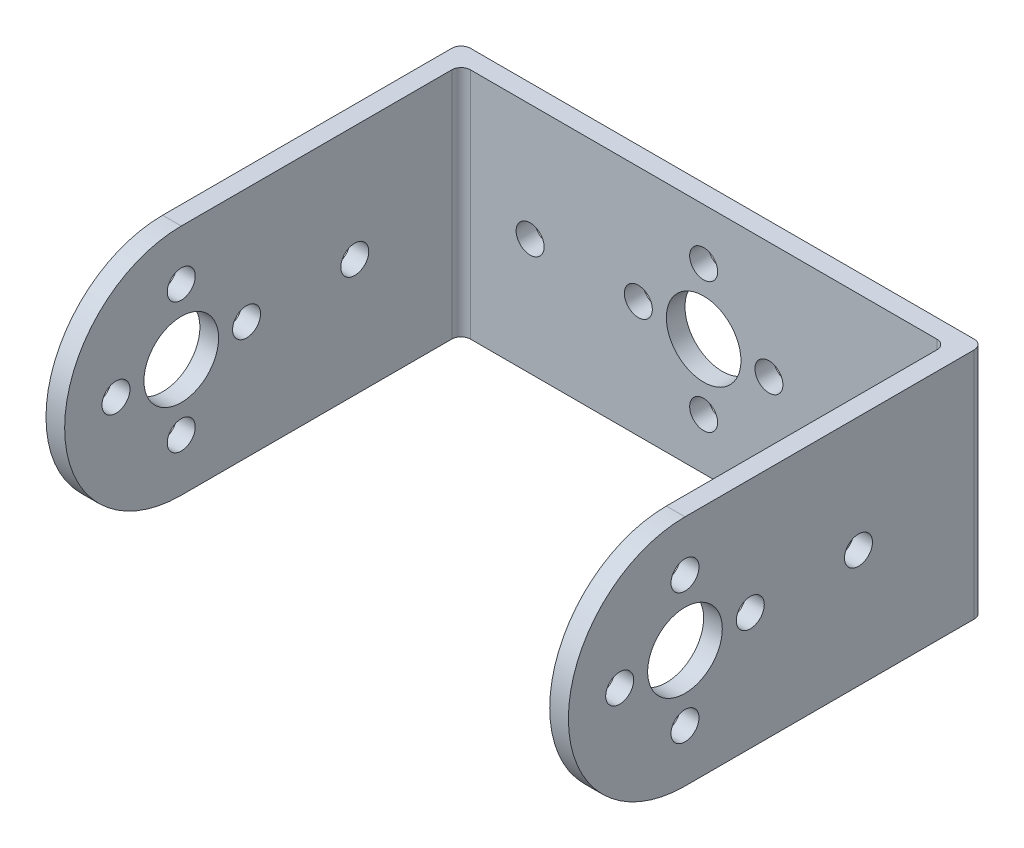
ISO-10303-21;
HEADER;
FILE_DESCRIPTION(('STEP AP214'),'2;1');
FILE_NAME('part.step','',(''),(''),'','','');
FILE_SCHEMA(('AUTOMOTIVE_DESIGN { 1 0 10303 214 1 1 1 1 }'));
ENDSEC;
DATA;
#1=APPLICATION_CONTEXT('core data for automotive mechanical design processes');
#2=APPLICATION_PROTOCOL_DEFINITION('international standard','automotive_design',2000,#1);
#3=PRODUCT_CONTEXT('',#1,'mechanical');
#4=PRODUCT('Part','Part','',(#3));
#5=PRODUCT_RELATED_PRODUCT_CATEGORY('part','',(#4));
#6=PRODUCT_DEFINITION_FORMATION('','',#4);
#7=PRODUCT_DEFINITION_CONTEXT('part definition',#1,'design');
#8=PRODUCT_DEFINITION('design','',#6,#7);
#9=PRODUCT_DEFINITION_SHAPE('','',#8);
#10=(LENGTH_UNIT() NAMED_UNIT(*) SI_UNIT(.MILLI.,.METRE.));
#11=(NAMED_UNIT(*) PLANE_ANGLE_UNIT() SI_UNIT($,.RADIAN.));
#12=(NAMED_UNIT(*) SI_UNIT($,.STERADIAN.) SOLID_ANGLE_UNIT());
#13=UNCERTAINTY_MEASURE_WITH_UNIT(LENGTH_MEASURE(1.E-05),#10,'distance_accuracy_value','');
#14=(GEOMETRIC_REPRESENTATION_CONTEXT(3) GLOBAL_UNCERTAINTY_ASSIGNED_CONTEXT((#13)) GLOBAL_UNIT_ASSIGNED_CONTEXT((#10,
#11,#12)) REPRESENTATION_CONTEXT('',''));
#15=CARTESIAN_POINT('',(0.,0.,0.));
#16=DIRECTION('',(0.,0.,1.));
#17=DIRECTION('',(1.,0.,0.));
#18=AXIS2_PLACEMENT_3D('',#15,#16,#17);
#19=CARTESIAN_POINT('',(28.,12.5,44.5));
#20=DIRECTION('',(-1.,0.,0.));
#21=DIRECTION('',(0.,0.,1.));
#22=AXIS2_PLACEMENT_3D('',#19,#20,#21);
#23=PLANE('',#22);
#24=CARTESIAN_POINT('',(28.,0.108344675926573,25.));
#25=DIRECTION('',(1.,0.,0.));
#26=DIRECTION('',(0.,0.,-1.));
#27=AXIS2_PLACEMENT_3D('',#24,#25,#26);
#28=CIRCLE('',#27,1.5);
#29=CARTESIAN_POINT('',(28.,0.108344675926573,23.5));
#30=VERTEX_POINT('',#29);
#31=EDGE_CURVE('E632',#30,#30,#28,.T.);
#32=ORIENTED_EDGE('',*,*,#31,.F.);
#33=EDGE_LOOP('',(#32));
#34=FACE_BOUND('',#33,.T.);
#35=CARTESIAN_POINT('',(28.,-6.89165532407343,32.));
#36=DIRECTION('',(1.,0.,0.));
#37=DIRECTION('',(0.,0.,-1.));
#38=AXIS2_PLACEMENT_3D('',#35,#36,#37);
#39=CIRCLE('',#38,1.5);
#40=CARTESIAN_POINT('',(28.,-6.89165532407343,30.5));
#41=VERTEX_POINT('',#40);
#42=EDGE_CURVE('E759',#41,#41,#39,.T.);
#43=ORIENTED_EDGE('',*,*,#42,.F.);
#44=EDGE_LOOP('',(#43));
#45=FACE_BOUND('',#44,.T.);
#46=CARTESIAN_POINT('',(28.,0.108344675926573,39.));
#47=DIRECTION('',(1.,0.,0.));
#48=DIRECTION('',(0.,0.,-1.));
#49=AXIS2_PLACEMENT_3D('',#46,#47,#48);
#50=CIRCLE('',#49,1.5);
#51=CARTESIAN_POINT('',(28.,0.108344675926573,37.5));
#52=VERTEX_POINT('',#51);
#53=EDGE_CURVE('E749',#52,#52,#50,.T.);
#54=ORIENTED_EDGE('',*,*,#53,.F.);
#55=EDGE_LOOP('',(#54));
#56=FACE_BOUND('',#55,.T.);
#57=CARTESIAN_POINT('',(28.,7.10834467592657,32.));
#58=DIRECTION('',(1.,0.,0.));
#59=DIRECTION('',(0.,0.,-1.));
#60=AXIS2_PLACEMENT_3D('',#57,#58,#59);
#61=CIRCLE('',#60,1.5);
#62=CARTESIAN_POINT('',(28.,7.10834467592657,30.5));
#63=VERTEX_POINT('',#62);
#64=EDGE_CURVE('E637',#63,#63,#61,.T.);
#65=ORIENTED_EDGE('',*,*,#64,.F.);
#66=EDGE_LOOP('',(#65));
#67=FACE_BOUND('',#66,.T.);
#68=CARTESIAN_POINT('',(28.,0.108344675926573,32.));
#69=DIRECTION('',(1.,0.,0.));
#70=DIRECTION('',(0.,0.,-1.));
#71=AXIS2_PLACEMENT_3D('',#68,#69,#70);
#72=CIRCLE('',#71,4.);
#73=CARTESIAN_POINT('',(28.,0.108344675926573,28.));
#74=VERTEX_POINT('',#73);
#75=EDGE_CURVE('E626',#74,#74,#72,.T.);
#76=ORIENTED_EDGE('',*,*,#75,.F.);
#77=EDGE_LOOP('',(#76));
#78=FACE_BOUND('',#77,.T.);
#79=CARTESIAN_POINT('',(28.,0.108344675926573,13.4));
#80=DIRECTION('',(1.,0.,0.));
#81=DIRECTION('',(0.,0.,-1.));
#82=AXIS2_PLACEMENT_3D('',#79,#80,#81);
#83=CIRCLE('',#82,1.5);
#84=CARTESIAN_POINT('',(28.,0.108344675926573,11.9));
#85=VERTEX_POINT('',#84);
#86=EDGE_CURVE('E651',#85,#85,#83,.T.);
#87=ORIENTED_EDGE('',*,*,#86,.F.);
#88=EDGE_LOOP('',(#87));
#89=FACE_BOUND('',#88,.T.);
#90=DIRECTION('',(0.,0.,-1.));
#91=VECTOR('',#90,1.);
#92=CARTESIAN_POINT('',(28.,-12.5,44.5));
#93=LINE('',#92,#91);
#94=CARTESIAN_POINT('',(28.,-12.5,32.));
#95=VERTEX_POINT('',#94);
#96=CARTESIAN_POINT('',(28.,-12.5,1.));
#97=VERTEX_POINT('',#96);
#98=EDGE_CURVE('E146',#95,#97,#93,.T.);
#99=ORIENTED_EDGE('',*,*,#98,.T.);
#100=DIRECTION('',(0.,1.,0.));
#101=VECTOR('',#100,1.);
#102=CARTESIAN_POINT('',(28.,12.5,1.));
#103=LINE('',#102,#101);
#104=CARTESIAN_POINT('',(28.,12.5,1.));
#105=VERTEX_POINT('',#104);
#106=EDGE_CURVE('E223',#97,#105,#103,.T.);
#107=ORIENTED_EDGE('',*,*,#106,.T.);
#108=DIRECTION('',(0.,0.,-1.));
#109=VECTOR('',#108,1.);
#110=CARTESIAN_POINT('',(28.,12.5,44.5));
#111=LINE('',#110,#109);
#112=CARTESIAN_POINT('',(28.,12.5,32.));
#113=VERTEX_POINT('',#112);
#114=EDGE_CURVE('E148',#113,#105,#111,.T.);
#115=ORIENTED_EDGE('',*,*,#114,.F.);
#116=CARTESIAN_POINT('',(28.,0.,32.));
#117=DIRECTION('',(1.,0.,0.));
#118=DIRECTION('',(0.,0.,-1.));
#119=AXIS2_PLACEMENT_3D('',#116,#117,#118);
#120=CIRCLE('',#119,12.5);
#121=EDGE_CURVE('E143',#113,#95,#120,.T.);
#122=ORIENTED_EDGE('',*,*,#121,.T.);
#123=EDGE_LOOP('',(#99,#107,#115,#122));
#124=FACE_BOUND('',#123,.T.);
#125=ADVANCED_FACE('F53',(#34,#45,#56,#67,#78,#89,#124),#23,.F.);
#126=CARTESIAN_POINT('',(-28.,12.5,44.5));
#127=DIRECTION('',(1.,0.,0.));
#128=DIRECTION('',(0.,0.,-1.));
#129=AXIS2_PLACEMENT_3D('',#126,#127,#128);
#130=PLANE('',#129);
#131=CARTESIAN_POINT('',(-28.,0.108344675926573,25.));
#132=DIRECTION('',(1.,0.,0.));
#133=DIRECTION('',(0.,0.,-1.));
#134=AXIS2_PLACEMENT_3D('',#131,#132,#133);
#135=CIRCLE('',#134,1.5);
#136=CARTESIAN_POINT('',(-28.,0.108344675926573,23.5));
#137=VERTEX_POINT('',#136);
#138=EDGE_CURVE('E350',#137,#137,#135,.T.);
#139=ORIENTED_EDGE('',*,*,#138,.T.);
#140=EDGE_LOOP('',(#139));
#141=FACE_BOUND('',#140,.T.);
#142=CARTESIAN_POINT('',(-28.,-6.89165532407343,32.));
#143=DIRECTION('',(1.,0.,0.));
#144=DIRECTION('',(0.,0.,-1.));
#145=AXIS2_PLACEMENT_3D('',#142,#143,#144);
#146=CIRCLE('',#145,1.5);
#147=CARTESIAN_POINT('',(-28.,-6.89165532407343,30.5));
#148=VERTEX_POINT('',#147);
#149=EDGE_CURVE('E754',#148,#148,#146,.T.);
#150=ORIENTED_EDGE('',*,*,#149,.T.);
#151=EDGE_LOOP('',(#150));
#152=FACE_BOUND('',#151,.T.);
#153=CARTESIAN_POINT('',(-28.,0.108344675926573,39.));
#154=DIRECTION('',(1.,0.,0.));
#155=DIRECTION('',(0.,0.,-1.));
#156=AXIS2_PLACEMENT_3D('',#153,#154,#155);
#157=CIRCLE('',#156,1.5);
#158=CARTESIAN_POINT('',(-28.,0.108344675926573,37.5));
#159=VERTEX_POINT('',#158);
#160=EDGE_CURVE('E640',#159,#159,#157,.T.);
#161=ORIENTED_EDGE('',*,*,#160,.T.);
#162=EDGE_LOOP('',(#161));
#163=FACE_BOUND('',#162,.T.);
#164=CARTESIAN_POINT('',(-28.,7.10834467592657,32.));
#165=DIRECTION('',(1.,0.,0.));
#166=DIRECTION('',(0.,0.,-1.));
#167=AXIS2_PLACEMENT_3D('',#164,#165,#166);
#168=CIRCLE('',#167,1.5);
#169=CARTESIAN_POINT('',(-28.,7.10834467592657,30.5));
#170=VERTEX_POINT('',#169);
#171=EDGE_CURVE('E629',#170,#170,#168,.T.);
#172=ORIENTED_EDGE('',*,*,#171,.T.);
#173=EDGE_LOOP('',(#172));
#174=FACE_BOUND('',#173,.T.);
#175=CARTESIAN_POINT('',(-28.,0.108344675926573,32.));
#176=DIRECTION('',(1.,0.,0.));
#177=DIRECTION('',(0.,0.,-1.));
#178=AXIS2_PLACEMENT_3D('',#175,#176,#177);
#179=CIRCLE('',#178,4.);
#180=CARTESIAN_POINT('',(-28.,0.108344675926573,28.));
#181=VERTEX_POINT('',#180);
#182=EDGE_CURVE('E194',#181,#181,#179,.T.);
#183=ORIENTED_EDGE('',*,*,#182,.T.);
#184=EDGE_LOOP('',(#183));
#185=FACE_BOUND('',#184,.T.);
#186=CARTESIAN_POINT('',(-28.,0.108344675926573,13.4));
#187=DIRECTION('',(1.,0.,0.));
#188=DIRECTION('',(0.,0.,-1.));
#189=AXIS2_PLACEMENT_3D('',#186,#187,#188);
#190=CIRCLE('',#189,1.5);
#191=CARTESIAN_POINT('',(-28.,0.108344675926573,11.9));
#192=VERTEX_POINT('',#191);
#193=EDGE_CURVE('E189',#192,#192,#190,.T.);
#194=ORIENTED_EDGE('',*,*,#193,.T.);
#195=EDGE_LOOP('',(#194));
#196=FACE_BOUND('',#195,.T.);
#197=DIRECTION('',(0.,0.,-1.));
#198=VECTOR('',#197,1.);
#199=CARTESIAN_POINT('',(-28.,12.5,44.5));
#200=LINE('',#199,#198);
#201=CARTESIAN_POINT('',(-28.,12.5,32.));
#202=VERTEX_POINT('',#201);
#203=CARTESIAN_POINT('',(-28.,12.5,1.));
#204=VERTEX_POINT('',#203);
#205=EDGE_CURVE('E173',#202,#204,#200,.T.);
#206=ORIENTED_EDGE('',*,*,#205,.T.);
#207=DIRECTION('',(0.,-1.,0.));
#208=VECTOR('',#207,1.);
#209=CARTESIAN_POINT('',(-28.,12.5,1.));
#210=LINE('',#209,#208);
#211=CARTESIAN_POINT('',(-28.,-12.5,1.));
#212=VERTEX_POINT('',#211);
#213=EDGE_CURVE('E184',#204,#212,#210,.T.);
#214=ORIENTED_EDGE('',*,*,#213,.T.);
#215=DIRECTION('',(0.,0.,-1.));
#216=VECTOR('',#215,1.);
#217=CARTESIAN_POINT('',(-28.,-12.5,44.5));
#218=LINE('',#217,#216);
#219=CARTESIAN_POINT('',(-28.,-12.5,32.));
#220=VERTEX_POINT('',#219);
#221=EDGE_CURVE('E170',#220,#212,#218,.T.);
#222=ORIENTED_EDGE('',*,*,#221,.F.);
#223=CARTESIAN_POINT('',(-28.,0.,32.));
#224=DIRECTION('',(1.,0.,0.));
#225=DIRECTION('',(0.,0.,-1.));
#226=AXIS2_PLACEMENT_3D('',#223,#224,#225);
#227=CIRCLE('',#226,12.5);
#228=EDGE_CURVE('E152',#202,#220,#227,.T.);
#229=ORIENTED_EDGE('',*,*,#228,.F.);
#230=EDGE_LOOP('',(#206,#214,#222,#229));
#231=FACE_BOUND('',#230,.T.);
#232=ADVANCED_FACE('F281',(#141,#152,#163,#174,#185,#196,#231),#130,.F.);
#233=CARTESIAN_POINT('',(26.,12.5,44.5));
#234=DIRECTION('',(1.,0.,0.));
#235=DIRECTION('',(0.,0.,-1.));
#236=AXIS2_PLACEMENT_3D('',#233,#234,#235);
#237=PLANE('',#236);
#238=CARTESIAN_POINT('',(26.,0.108344675926573,25.));
#239=DIRECTION('',(1.,0.,0.));
#240=DIRECTION('',(0.,0.,-1.));
#241=AXIS2_PLACEMENT_3D('',#238,#239,#240);
#242=CIRCLE('',#241,1.5);
#243=CARTESIAN_POINT('',(26.,0.108344675926573,23.5));
#244=VERTEX_POINT('',#243);
#245=EDGE_CURVE('E210',#244,#244,#242,.T.);
#246=ORIENTED_EDGE('',*,*,#245,.T.);
#247=EDGE_LOOP('',(#246));
#248=FACE_BOUND('',#247,.T.);
#249=CARTESIAN_POINT('',(26.,-6.89165532407343,32.));
#250=DIRECTION('',(1.,0.,0.));
#251=DIRECTION('',(0.,0.,-1.));
#252=AXIS2_PLACEMENT_3D('',#249,#250,#251);
#253=CIRCLE('',#252,1.5);
#254=CARTESIAN_POINT('',(26.,-6.89165532407343,30.5));
#255=VERTEX_POINT('',#254);
#256=EDGE_CURVE('E206',#255,#255,#253,.T.);
#257=ORIENTED_EDGE('',*,*,#256,.T.);
#258=EDGE_LOOP('',(#257));
#259=FACE_BOUND('',#258,.T.);
#260=CARTESIAN_POINT('',(26.,0.108344675926573,39.));
#261=DIRECTION('',(1.,0.,0.));
#262=DIRECTION('',(0.,0.,-1.));
#263=AXIS2_PLACEMENT_3D('',#260,#261,#262);
#264=CIRCLE('',#263,1.5);
#265=CARTESIAN_POINT('',(26.,0.108344675926573,37.5));
#266=VERTEX_POINT('',#265);
#267=EDGE_CURVE('E202',#266,#266,#264,.T.);
#268=ORIENTED_EDGE('',*,*,#267,.T.);
#269=EDGE_LOOP('',(#268));
#270=FACE_BOUND('',#269,.T.);
#271=CARTESIAN_POINT('',(26.,7.10834467592657,32.));
#272=DIRECTION('',(1.,0.,0.));
#273=DIRECTION('',(0.,0.,-1.));
#274=AXIS2_PLACEMENT_3D('',#271,#272,#273);
#275=CIRCLE('',#274,1.5);
#276=CARTESIAN_POINT('',(26.,7.10834467592657,30.5));
#277=VERTEX_POINT('',#276);
#278=EDGE_CURVE('E198',#277,#277,#275,.T.);
#279=ORIENTED_EDGE('',*,*,#278,.T.);
#280=EDGE_LOOP('',(#279));
#281=FACE_BOUND('',#280,.T.);
#282=CARTESIAN_POINT('',(26.,0.108344675926573,32.));
#283=DIRECTION('',(1.,0.,0.));
#284=DIRECTION('',(0.,0.,-1.));
#285=AXIS2_PLACEMENT_3D('',#282,#283,#284);
#286=CIRCLE('',#285,4.);
#287=CARTESIAN_POINT('',(26.,0.108344675926573,28.));
#288=VERTEX_POINT('',#287);
#289=EDGE_CURVE('E193',#288,#288,#286,.T.);
#290=ORIENTED_EDGE('',*,*,#289,.T.);
#291=EDGE_LOOP('',(#290));
#292=FACE_BOUND('',#291,.T.);
#293=CARTESIAN_POINT('',(26.,0.108344675926573,13.4));
#294=DIRECTION('',(1.,0.,0.));
#295=DIRECTION('',(0.,0.,-1.));
#296=AXIS2_PLACEMENT_3D('',#293,#294,#295);
#297=CIRCLE('',#296,1.5);
#298=CARTESIAN_POINT('',(26.,0.108344675926573,11.9));
#299=VERTEX_POINT('',#298);
#300=EDGE_CURVE('E188',#299,#299,#297,.T.);
#301=ORIENTED_EDGE('',*,*,#300,.T.);
#302=EDGE_LOOP('',(#301));
#303=FACE_BOUND('',#302,.T.);
#304=DIRECTION('',(0.,0.,1.));
#305=VECTOR('',#304,1.);
#306=CARTESIAN_POINT('',(26.,12.5,44.5));
#307=LINE('',#306,#305);
#308=CARTESIAN_POINT('',(26.,12.5,3.));
#309=VERTEX_POINT('',#308);
#310=CARTESIAN_POINT('',(26.,12.5,32.));
#311=VERTEX_POINT('',#310);
#312=EDGE_CURVE('E263',#309,#311,#307,.T.);
#313=ORIENTED_EDGE('',*,*,#312,.F.);
#314=DIRECTION('',(0.,-1.,0.));
#315=VECTOR('',#314,1.);
#316=CARTESIAN_POINT('',(26.,-12.5,3.));
#317=LINE('',#316,#315);
#318=CARTESIAN_POINT('',(26.,-12.5,3.));
#319=VERTEX_POINT('',#318);
#320=EDGE_CURVE('E225',#309,#319,#317,.T.);
#321=ORIENTED_EDGE('',*,*,#320,.T.);
#322=DIRECTION('',(0.,0.,1.));
#323=VECTOR('',#322,1.);
#324=CARTESIAN_POINT('',(26.,-12.5,44.5));
#325=LINE('',#324,#323);
#326=CARTESIAN_POINT('',(26.,-12.5,32.));
#327=VERTEX_POINT('',#326);
#328=EDGE_CURVE('E266',#319,#327,#325,.T.);
#329=ORIENTED_EDGE('',*,*,#328,.T.);
#330=CARTESIAN_POINT('',(26.,0.,32.));
#331=DIRECTION('',(1.,0.,0.));
#332=DIRECTION('',(0.,0.,-1.));
#333=AXIS2_PLACEMENT_3D('',#330,#331,#332);
#334=CIRCLE('',#333,12.5);
#335=EDGE_CURVE('E160',#311,#327,#334,.T.);
#336=ORIENTED_EDGE('',*,*,#335,.F.);
#337=EDGE_LOOP('',(#313,#321,#329,#336));
#338=FACE_BOUND('',#337,.T.);
#339=ADVANCED_FACE('F293',(#248,#259,#270,#281,#292,#303,#338),#237,.F.);
#340=CARTESIAN_POINT('',(-26.,12.5,1.99999999999999));
#341=DIRECTION('',(-1.,0.,0.));
#342=DIRECTION('',(0.,0.,1.));
#343=AXIS2_PLACEMENT_3D('',#340,#341,#342);
#344=PLANE('',#343);
#345=CARTESIAN_POINT('',(-26.,0.108344675926573,25.));
#346=DIRECTION('',(-1.,0.,0.));
#347=DIRECTION('',(0.,0.,1.));
#348=AXIS2_PLACEMENT_3D('',#345,#346,#347);
#349=CIRCLE('',#348,1.5);
#350=CARTESIAN_POINT('',(-26.,0.108344675926573,26.5));
#351=VERTEX_POINT('',#350);
#352=EDGE_CURVE('E207',#351,#351,#349,.T.);
#353=ORIENTED_EDGE('',*,*,#352,.T.);
#354=EDGE_LOOP('',(#353));
#355=FACE_BOUND('',#354,.T.);
#356=CARTESIAN_POINT('',(-26.,-6.89165532407343,32.));
#357=DIRECTION('',(-1.,0.,0.));
#358=DIRECTION('',(0.,0.,1.));
#359=AXIS2_PLACEMENT_3D('',#356,#357,#358);
#360=CIRCLE('',#359,1.5);
#361=CARTESIAN_POINT('',(-26.,-6.89165532407343,33.5));
#362=VERTEX_POINT('',#361);
#363=EDGE_CURVE('E203',#362,#362,#360,.T.);
#364=ORIENTED_EDGE('',*,*,#363,.T.);
#365=EDGE_LOOP('',(#364));
#366=FACE_BOUND('',#365,.T.);
#367=CARTESIAN_POINT('',(-26.,0.108344675926573,39.));
#368=DIRECTION('',(-1.,0.,0.));
#369=DIRECTION('',(0.,0.,1.));
#370=AXIS2_PLACEMENT_3D('',#367,#368,#369);
#371=CIRCLE('',#370,1.5);
#372=CARTESIAN_POINT('',(-26.,0.108344675926573,40.5));
#373=VERTEX_POINT('',#372);
#374=EDGE_CURVE('E199',#373,#373,#371,.T.);
#375=ORIENTED_EDGE('',*,*,#374,.T.);
#376=EDGE_LOOP('',(#375));
#377=FACE_BOUND('',#376,.T.);
#378=CARTESIAN_POINT('',(-26.,7.10834467592657,32.));
#379=DIRECTION('',(-1.,0.,0.));
#380=DIRECTION('',(0.,0.,1.));
#381=AXIS2_PLACEMENT_3D('',#378,#379,#380);
#382=CIRCLE('',#381,1.5);
#383=CARTESIAN_POINT('',(-26.,7.10834467592657,33.5));
#384=VERTEX_POINT('',#383);
#385=EDGE_CURVE('E195',#384,#384,#382,.T.);
#386=ORIENTED_EDGE('',*,*,#385,.T.);
#387=EDGE_LOOP('',(#386));
#388=FACE_BOUND('',#387,.T.);
#389=CARTESIAN_POINT('',(-26.,0.108344675926573,32.));
#390=DIRECTION('',(-1.,0.,0.));
#391=DIRECTION('',(0.,0.,1.));
#392=AXIS2_PLACEMENT_3D('',#389,#390,#391);
#393=CIRCLE('',#392,4.);
#394=CARTESIAN_POINT('',(-26.,0.108344675926573,36.));
#395=VERTEX_POINT('',#394);
#396=EDGE_CURVE('E190',#395,#395,#393,.T.);
#397=ORIENTED_EDGE('',*,*,#396,.T.);
#398=EDGE_LOOP('',(#397));
#399=FACE_BOUND('',#398,.T.);
#400=CARTESIAN_POINT('',(-26.,0.108344675926573,13.4));
#401=DIRECTION('',(-1.,0.,0.));
#402=DIRECTION('',(0.,0.,1.));
#403=AXIS2_PLACEMENT_3D('',#400,#401,#402);
#404=CIRCLE('',#403,1.5);
#405=CARTESIAN_POINT('',(-26.,0.108344675926573,14.9));
#406=VERTEX_POINT('',#405);
#407=EDGE_CURVE('E185',#406,#406,#404,.T.);
#408=ORIENTED_EDGE('',*,*,#407,.T.);
#409=EDGE_LOOP('',(#408));
#410=FACE_BOUND('',#409,.T.);
#411=DIRECTION('',(0.,0.,-1.));
#412=VECTOR('',#411,1.);
#413=CARTESIAN_POINT('',(-26.,-12.5,1.99999999999999));
#414=LINE('',#413,#412);
#415=CARTESIAN_POINT('',(-26.,-12.5,32.));
#416=VERTEX_POINT('',#415);
#417=CARTESIAN_POINT('',(-26.,-12.5,2.99999999999999));
#418=VERTEX_POINT('',#417);
#419=EDGE_CURVE('E241',#416,#418,#414,.T.);
#420=ORIENTED_EDGE('',*,*,#419,.T.);
#421=DIRECTION('',(0.,-1.,0.));
#422=VECTOR('',#421,1.);
#423=CARTESIAN_POINT('',(-26.,12.5,2.99999999999999));
#424=LINE('',#423,#422);
#425=CARTESIAN_POINT('',(-26.,12.5,2.99999999999999));
#426=VERTEX_POINT('',#425);
#427=EDGE_CURVE('E233',#418,#426,#424,.F.);
#428=ORIENTED_EDGE('',*,*,#427,.T.);
#429=DIRECTION('',(0.,0.,-1.));
#430=VECTOR('',#429,1.);
#431=CARTESIAN_POINT('',(-26.,12.5,1.99999999999999));
#432=LINE('',#431,#430);
#433=CARTESIAN_POINT('',(-26.,12.5,32.));
#434=VERTEX_POINT('',#433);
#435=EDGE_CURVE('E259',#434,#426,#432,.T.);
#436=ORIENTED_EDGE('',*,*,#435,.F.);
#437=CARTESIAN_POINT('',(-26.,0.,32.));
#438=DIRECTION('',(-1.,0.,0.));
#439=DIRECTION('',(0.,0.,1.));
#440=AXIS2_PLACEMENT_3D('',#437,#438,#439);
#441=CIRCLE('',#440,12.5);
#442=EDGE_CURVE('E182',#416,#434,#441,.T.);
#443=ORIENTED_EDGE('',*,*,#442,.F.);
#444=EDGE_LOOP('',(#420,#428,#436,#443));
#445=FACE_BOUND('',#444,.T.);
#446=ADVANCED_FACE('F248',(#355,#366,#377,#388,#399,#410,#445),#344,.F.);
#447=CARTESIAN_POINT('',(-28.,-12.5,44.5));
#448=DIRECTION('',(0.,1.,0.));
#449=DIRECTION('',(0.,0.,1.));
#450=AXIS2_PLACEMENT_3D('',#447,#448,#449);
#451=PLANE('',#450);
#452=ORIENTED_EDGE('',*,*,#221,.T.);
#453=CARTESIAN_POINT('',(-27.,-12.5,1.));
#454=DIRECTION('',(0.,1.,0.));
#455=DIRECTION('',(0.,0.,1.));
#456=AXIS2_PLACEMENT_3D('',#453,#454,#455);
#457=CIRCLE('',#456,1.);
#458=CARTESIAN_POINT('',(-27.,-12.5,0.));
#459=VERTEX_POINT('',#458);
#460=EDGE_CURVE('E214',#212,#459,#457,.F.);
#461=ORIENTED_EDGE('',*,*,#460,.T.);
#462=DIRECTION('',(1.,0.,0.));
#463=VECTOR('',#462,1.);
#464=CARTESIAN_POINT('',(-28.,-12.5,0.));
#465=LINE('',#464,#463);
#466=CARTESIAN_POINT('',(27.,-12.5,0.));
#467=VERTEX_POINT('',#466);
#468=EDGE_CURVE('E171',#459,#467,#465,.T.);
#469=ORIENTED_EDGE('',*,*,#468,.T.);
#470=CARTESIAN_POINT('',(27.,-12.5,1.));
#471=DIRECTION('',(0.,1.,0.));
#472=DIRECTION('',(0.,0.,1.));
#473=AXIS2_PLACEMENT_3D('',#470,#471,#472);
#474=CIRCLE('',#473,1.);
#475=EDGE_CURVE('E169',#467,#97,#474,.F.);
#476=ORIENTED_EDGE('',*,*,#475,.T.);
#477=ORIENTED_EDGE('',*,*,#98,.F.);
#478=DIRECTION('',(1.,0.,0.));
#479=VECTOR('',#478,1.);
#480=CARTESIAN_POINT('',(-28.,-12.5,32.));
#481=LINE('',#480,#479);
#482=EDGE_CURVE('E157',#327,#95,#481,.T.);
#483=ORIENTED_EDGE('',*,*,#482,.F.);
#484=ORIENTED_EDGE('',*,*,#328,.F.);
#485=CARTESIAN_POINT('',(25.,-12.5,3.));
#486=DIRECTION('',(0.,1.,0.));
#487=DIRECTION('',(0.,0.,1.));
#488=AXIS2_PLACEMENT_3D('',#485,#486,#487);
#489=CIRCLE('',#488,1.);
#490=CARTESIAN_POINT('',(25.,-12.5,1.99999999999999));
#491=VERTEX_POINT('',#490);
#492=EDGE_CURVE('E235',#319,#491,#489,.T.);
#493=ORIENTED_EDGE('',*,*,#492,.T.);
#494=DIRECTION('',(1.,0.,0.));
#495=VECTOR('',#494,1.);
#496=CARTESIAN_POINT('',(26.,-12.5,1.99999999999999));
#497=LINE('',#496,#495);
#498=CARTESIAN_POINT('',(-25.,-12.5,1.99999999999999));
#499=VERTEX_POINT('',#498);
#500=EDGE_CURVE('E243',#499,#491,#497,.T.);
#501=ORIENTED_EDGE('',*,*,#500,.F.);
#502=CARTESIAN_POINT('',(-25.,-12.5,2.99999999999999));
#503=DIRECTION('',(0.,1.,0.));
#504=DIRECTION('',(0.,0.,1.));
#505=AXIS2_PLACEMENT_3D('',#502,#503,#504);
#506=CIRCLE('',#505,1.);
#507=EDGE_CURVE('E61',#499,#418,#506,.T.);
#508=ORIENTED_EDGE('',*,*,#507,.T.);
#509=ORIENTED_EDGE('',*,*,#419,.F.);
#510=EDGE_CURVE('E153',#220,#416,#481,.T.);
#511=ORIENTED_EDGE('',*,*,#510,.F.);
#512=EDGE_LOOP('',(#452,#461,#469,#476,#477,#483,#484,#493,#501,#508,#509,#511));
#513=FACE_BOUND('',#512,.T.);
#514=ADVANCED_FACE('F166',(#513),#451,.F.);
#515=CARTESIAN_POINT('',(-28.,12.5,44.5));
#516=DIRECTION('',(0.,-1.,0.));
#517=DIRECTION('',(0.,0.,-1.));
#518=AXIS2_PLACEMENT_3D('',#515,#516,#517);
#519=PLANE('',#518);
#520=DIRECTION('',(-1.,0.,0.));
#521=VECTOR('',#520,1.);
#522=CARTESIAN_POINT('',(-28.,12.5,0.));
#523=LINE('',#522,#521);
#524=CARTESIAN_POINT('',(27.,12.5,0.));
#525=VERTEX_POINT('',#524);
#526=CARTESIAN_POINT('',(-27.,12.5,0.));
#527=VERTEX_POINT('',#526);
#528=EDGE_CURVE('E175',#525,#527,#523,.T.);
#529=ORIENTED_EDGE('',*,*,#528,.T.);
#530=CARTESIAN_POINT('',(-27.,12.5,1.));
#531=DIRECTION('',(0.,-1.,0.));
#532=DIRECTION('',(0.,0.,-1.));
#533=AXIS2_PLACEMENT_3D('',#530,#531,#532);
#534=CIRCLE('',#533,1.);
#535=EDGE_CURVE('E221',#527,#204,#534,.F.);
#536=ORIENTED_EDGE('',*,*,#535,.T.);
#537=ORIENTED_EDGE('',*,*,#205,.F.);
#538=DIRECTION('',(1.,0.,0.));
#539=VECTOR('',#538,1.);
#540=CARTESIAN_POINT('',(-28.,12.5,32.));
#541=LINE('',#540,#539);
#542=EDGE_CURVE('E291',#202,#434,#541,.T.);
#543=ORIENTED_EDGE('',*,*,#542,.T.);
#544=ORIENTED_EDGE('',*,*,#435,.T.);
#545=CARTESIAN_POINT('',(-25.,12.5,2.99999999999999));
#546=DIRECTION('',(0.,-1.,0.));
#547=DIRECTION('',(0.,0.,-1.));
#548=AXIS2_PLACEMENT_3D('',#545,#546,#547);
#549=CIRCLE('',#548,1.);
#550=CARTESIAN_POINT('',(-25.,12.5,1.99999999999999));
#551=VERTEX_POINT('',#550);
#552=EDGE_CURVE('E12',#426,#551,#549,.T.);
#553=ORIENTED_EDGE('',*,*,#552,.T.);
#554=DIRECTION('',(1.,0.,0.));
#555=VECTOR('',#554,1.);
#556=CARTESIAN_POINT('',(26.,12.5,1.99999999999999));
#557=LINE('',#556,#555);
#558=CARTESIAN_POINT('',(25.,12.5,1.99999999999999));
#559=VERTEX_POINT('',#558);
#560=EDGE_CURVE('E257',#551,#559,#557,.T.);
#561=ORIENTED_EDGE('',*,*,#560,.T.);
#562=CARTESIAN_POINT('',(25.,12.5,3.));
#563=DIRECTION('',(0.,-1.,0.));
#564=DIRECTION('',(0.,0.,-1.));
#565=AXIS2_PLACEMENT_3D('',#562,#563,#564);
#566=CIRCLE('',#565,1.);
#567=EDGE_CURVE('E76',#559,#309,#566,.T.);
#568=ORIENTED_EDGE('',*,*,#567,.T.);
#569=ORIENTED_EDGE('',*,*,#312,.T.);
#570=EDGE_CURVE('E289',#311,#113,#541,.T.);
#571=ORIENTED_EDGE('',*,*,#570,.T.);
#572=ORIENTED_EDGE('',*,*,#114,.T.);
#573=CARTESIAN_POINT('',(27.,12.5,1.));
#574=DIRECTION('',(0.,-1.,0.));
#575=DIRECTION('',(0.,0.,-1.));
#576=AXIS2_PLACEMENT_3D('',#573,#574,#575);
#577=CIRCLE('',#576,1.);
#578=EDGE_CURVE('E68',#105,#525,#577,.F.);
#579=ORIENTED_EDGE('',*,*,#578,.T.);
#580=EDGE_LOOP('',(#529,#536,#537,#543,#544,#553,#561,#568,#569,#571,#572,#579));
#581=FACE_BOUND('',#580,.T.);
#582=ADVANCED_FACE('F256',(#581),#519,.F.);
#583=CARTESIAN_POINT('',(0.,0.,0.));
#584=DIRECTION('',(0.,0.,1.));
#585=DIRECTION('',(1.,0.,0.));
#586=AXIS2_PLACEMENT_3D('',#583,#584,#585);
#587=PLANE('',#586);
#588=CARTESIAN_POINT('',(7.,0.,0.));
#589=DIRECTION('',(0.,0.,1.));
#590=DIRECTION('',(1.,0.,0.));
#591=AXIS2_PLACEMENT_3D('',#588,#589,#590);
#592=CIRCLE('',#591,1.5);
#593=CARTESIAN_POINT('',(8.5,0.,0.));
#594=VERTEX_POINT('',#593);
#595=EDGE_CURVE('E671',#594,#594,#592,.T.);
#596=ORIENTED_EDGE('',*,*,#595,.T.);
#597=EDGE_LOOP('',(#596));
#598=FACE_BOUND('',#597,.T.);
#599=CARTESIAN_POINT('',(18.6,0.,0.));
#600=DIRECTION('',(0.,0.,1.));
#601=DIRECTION('',(1.,0.,0.));
#602=AXIS2_PLACEMENT_3D('',#599,#600,#601);
#603=CIRCLE('',#602,1.5);
#604=CARTESIAN_POINT('',(20.1,0.,0.));
#605=VERTEX_POINT('',#604);
#606=EDGE_CURVE('E659',#605,#605,#603,.T.);
#607=ORIENTED_EDGE('',*,*,#606,.T.);
#608=EDGE_LOOP('',(#607));
#609=FACE_BOUND('',#608,.T.);
#610=CARTESIAN_POINT('',(-18.6,0.,0.));
#611=DIRECTION('',(0.,0.,1.));
#612=DIRECTION('',(-1.,0.,0.));
#613=AXIS2_PLACEMENT_3D('',#610,#611,#612);
#614=CIRCLE('',#613,1.5);
#615=CARTESIAN_POINT('',(-20.1,0.,0.));
#616=VERTEX_POINT('',#615);
#617=EDGE_CURVE('E666',#616,#616,#614,.T.);
#618=ORIENTED_EDGE('',*,*,#617,.T.);
#619=EDGE_LOOP('',(#618));
#620=FACE_BOUND('',#619,.T.);
#621=CARTESIAN_POINT('',(-7.,0.,0.));
#622=DIRECTION('',(0.,0.,1.));
#623=DIRECTION('',(1.,0.,0.));
#624=AXIS2_PLACEMENT_3D('',#621,#622,#623);
#625=CIRCLE('',#624,1.5);
#626=CARTESIAN_POINT('',(-5.5,0.,0.));
#627=VERTEX_POINT('',#626);
#628=EDGE_CURVE('E689',#627,#627,#625,.T.);
#629=ORIENTED_EDGE('',*,*,#628,.T.);
#630=EDGE_LOOP('',(#629));
#631=FACE_BOUND('',#630,.T.);
#632=CARTESIAN_POINT('',(0.,-7.,0.));
#633=DIRECTION('',(0.,0.,1.));
#634=DIRECTION('',(1.,0.,0.));
#635=AXIS2_PLACEMENT_3D('',#632,#633,#634);
#636=CIRCLE('',#635,1.5);
#637=CARTESIAN_POINT('',(1.5,-7.,0.));
#638=VERTEX_POINT('',#637);
#639=EDGE_CURVE('E683',#638,#638,#636,.T.);
#640=ORIENTED_EDGE('',*,*,#639,.T.);
#641=EDGE_LOOP('',(#640));
#642=FACE_BOUND('',#641,.T.);
#643=CARTESIAN_POINT('',(0.,7.,0.));
#644=DIRECTION('',(0.,0.,1.));
#645=DIRECTION('',(1.,0.,0.));
#646=AXIS2_PLACEMENT_3D('',#643,#644,#645);
#647=CIRCLE('',#646,1.5);
#648=CARTESIAN_POINT('',(1.5,7.,0.));
#649=VERTEX_POINT('',#648);
#650=EDGE_CURVE('E677',#649,#649,#647,.T.);
#651=ORIENTED_EDGE('',*,*,#650,.T.);
#652=EDGE_LOOP('',(#651));
#653=FACE_BOUND('',#652,.T.);
#654=CARTESIAN_POINT('',(0.,0.,0.));
#655=DIRECTION('',(0.,0.,1.));
#656=DIRECTION('',(1.,0.,0.));
#657=AXIS2_PLACEMENT_3D('',#654,#655,#656);
#658=CIRCLE('',#657,4.);
#659=CARTESIAN_POINT('',(4.,0.,0.));
#660=VERTEX_POINT('',#659);
#661=EDGE_CURVE('E163',#660,#660,#658,.T.);
#662=ORIENTED_EDGE('',*,*,#661,.T.);
#663=EDGE_LOOP('',(#662));
#664=FACE_BOUND('',#663,.T.);
#665=ORIENTED_EDGE('',*,*,#468,.F.);
#666=DIRECTION('',(0.,-1.,0.));
#667=VECTOR('',#666,1.);
#668=CARTESIAN_POINT('',(-27.,0.,0.));
#669=LINE('',#668,#667);
#670=EDGE_CURVE('E218',#459,#527,#669,.F.);
#671=ORIENTED_EDGE('',*,*,#670,.T.);
#672=ORIENTED_EDGE('',*,*,#528,.F.);
#673=DIRECTION('',(0.,1.,0.));
#674=VECTOR('',#673,1.);
#675=CARTESIAN_POINT('',(27.,0.,0.));
#676=LINE('',#675,#674);
#677=EDGE_CURVE('E216',#525,#467,#676,.F.);
#678=ORIENTED_EDGE('',*,*,#677,.T.);
#679=EDGE_LOOP('',(#665,#671,#672,#678));
#680=FACE_BOUND('',#679,.T.);
#681=ADVANCED_FACE('F413',(#598,#609,#620,#631,#642,#653,#664,#680),#587,.F.);
#682=CARTESIAN_POINT('',(26.,12.5,1.99999999999999));
#683=DIRECTION('',(0.,0.,-1.));
#684=DIRECTION('',(-1.,0.,0.));
#685=AXIS2_PLACEMENT_3D('',#682,#683,#684);
#686=PLANE('',#685);
#687=CARTESIAN_POINT('',(7.,0.,1.99999999999999));
#688=DIRECTION('',(0.,0.,1.));
#689=DIRECTION('',(1.,0.,0.));
#690=AXIS2_PLACEMENT_3D('',#687,#688,#689);
#691=CIRCLE('',#690,1.5);
#692=CARTESIAN_POINT('',(8.5,0.,1.99999999999999));
#693=VERTEX_POINT('',#692);
#694=EDGE_CURVE('E662',#693,#693,#691,.T.);
#695=ORIENTED_EDGE('',*,*,#694,.F.);
#696=EDGE_LOOP('',(#695));
#697=FACE_BOUND('',#696,.T.);
#698=CARTESIAN_POINT('',(18.6,0.,1.99999999999999));
#699=DIRECTION('',(0.,0.,1.));
#700=DIRECTION('',(1.,0.,0.));
#701=AXIS2_PLACEMENT_3D('',#698,#699,#700);
#702=CIRCLE('',#701,1.5);
#703=CARTESIAN_POINT('',(20.1,0.,1.99999999999999));
#704=VERTEX_POINT('',#703);
#705=EDGE_CURVE('E663',#704,#704,#702,.T.);
#706=ORIENTED_EDGE('',*,*,#705,.F.);
#707=EDGE_LOOP('',(#706));
#708=FACE_BOUND('',#707,.T.);
#709=CARTESIAN_POINT('',(-18.6,0.,1.99999999999999));
#710=DIRECTION('',(0.,0.,1.));
#711=DIRECTION('',(-1.,0.,0.));
#712=AXIS2_PLACEMENT_3D('',#709,#710,#711);
#713=CIRCLE('',#712,1.5);
#714=CARTESIAN_POINT('',(-20.1,0.,1.99999999999999));
#715=VERTEX_POINT('',#714);
#716=EDGE_CURVE('E658',#715,#715,#713,.T.);
#717=ORIENTED_EDGE('',*,*,#716,.F.);
#718=EDGE_LOOP('',(#717));
#719=FACE_BOUND('',#718,.T.);
#720=CARTESIAN_POINT('',(-7.,0.,1.99999999999999));
#721=DIRECTION('',(0.,0.,1.));
#722=DIRECTION('',(1.,0.,0.));
#723=AXIS2_PLACEMENT_3D('',#720,#721,#722);
#724=CIRCLE('',#723,1.5);
#725=CARTESIAN_POINT('',(-5.5,0.,1.99999999999999));
#726=VERTEX_POINT('',#725);
#727=EDGE_CURVE('E674',#726,#726,#724,.T.);
#728=ORIENTED_EDGE('',*,*,#727,.F.);
#729=EDGE_LOOP('',(#728));
#730=FACE_BOUND('',#729,.T.);
#731=CARTESIAN_POINT('',(0.,-7.,1.99999999999999));
#732=DIRECTION('',(0.,0.,1.));
#733=DIRECTION('',(1.,0.,0.));
#734=AXIS2_PLACEMENT_3D('',#731,#732,#733);
#735=CIRCLE('',#734,1.5);
#736=CARTESIAN_POINT('',(1.5,-7.,1.99999999999999));
#737=VERTEX_POINT('',#736);
#738=EDGE_CURVE('E686',#737,#737,#735,.T.);
#739=ORIENTED_EDGE('',*,*,#738,.F.);
#740=EDGE_LOOP('',(#739));
#741=FACE_BOUND('',#740,.T.);
#742=CARTESIAN_POINT('',(0.,7.,1.99999999999999));
#743=DIRECTION('',(0.,0.,1.));
#744=DIRECTION('',(1.,0.,0.));
#745=AXIS2_PLACEMENT_3D('',#742,#743,#744);
#746=CIRCLE('',#745,1.5);
#747=CARTESIAN_POINT('',(1.5,7.,1.99999999999999));
#748=VERTEX_POINT('',#747);
#749=EDGE_CURVE('E680',#748,#748,#746,.T.);
#750=ORIENTED_EDGE('',*,*,#749,.F.);
#751=EDGE_LOOP('',(#750));
#752=FACE_BOUND('',#751,.T.);
#753=CARTESIAN_POINT('',(0.,0.,1.99999999999999));
#754=DIRECTION('',(0.,0.,1.));
#755=DIRECTION('',(1.,0.,0.));
#756=AXIS2_PLACEMENT_3D('',#753,#754,#755);
#757=CIRCLE('',#756,4.);
#758=CARTESIAN_POINT('',(4.,0.,1.99999999999999));
#759=VERTEX_POINT('',#758);
#760=EDGE_CURVE('E287',#759,#759,#757,.T.);
#761=ORIENTED_EDGE('',*,*,#760,.F.);
#762=EDGE_LOOP('',(#761));
#763=FACE_BOUND('',#762,.T.);
#764=ORIENTED_EDGE('',*,*,#500,.T.);
#765=DIRECTION('',(0.,-1.,0.));
#766=VECTOR('',#765,1.);
#767=CARTESIAN_POINT('',(25.,12.5,1.99999999999999));
#768=LINE('',#767,#766);
#769=EDGE_CURVE('E231',#491,#559,#768,.F.);
#770=ORIENTED_EDGE('',*,*,#769,.T.);
#771=ORIENTED_EDGE('',*,*,#560,.F.);
#772=DIRECTION('',(0.,-1.,0.));
#773=VECTOR('',#772,1.);
#774=CARTESIAN_POINT('',(-25.,-12.5,1.99999999999999));
#775=LINE('',#774,#773);
#776=EDGE_CURVE('E228',#551,#499,#775,.T.);
#777=ORIENTED_EDGE('',*,*,#776,.T.);
#778=EDGE_LOOP('',(#764,#770,#771,#777));
#779=FACE_BOUND('',#778,.T.);
#780=ADVANCED_FACE('F261',(#697,#708,#719,#730,#741,#752,#763,#779),#686,.F.);
#781=CARTESIAN_POINT('',(-28.,0.,32.));
#782=DIRECTION('',(1.,0.,0.));
#783=DIRECTION('',(0.,0.,-1.));
#784=AXIS2_PLACEMENT_3D('',#781,#782,#783);
#785=CYLINDRICAL_SURFACE('',#784,12.5);
#786=ORIENTED_EDGE('',*,*,#442,.T.);
#787=ORIENTED_EDGE('',*,*,#542,.F.);
#788=ORIENTED_EDGE('',*,*,#228,.T.);
#789=ORIENTED_EDGE('',*,*,#510,.T.);
#790=EDGE_LOOP('',(#786,#787,#788,#789));
#791=FACE_BOUND('',#790,.T.);
#792=ADVANCED_FACE('F408',(#791),#785,.T.);
#793=ORIENTED_EDGE('',*,*,#335,.T.);
#794=ORIENTED_EDGE('',*,*,#482,.T.);
#795=ORIENTED_EDGE('',*,*,#121,.F.);
#796=ORIENTED_EDGE('',*,*,#570,.F.);
#797=EDGE_LOOP('',(#793,#794,#795,#796));
#798=FACE_BOUND('',#797,.T.);
#799=ADVANCED_FACE('F158',(#798),#785,.T.);
#800=CARTESIAN_POINT('',(0.,0.,0.));
#801=DIRECTION('',(0.,0.,1.));
#802=DIRECTION('',(1.,0.,0.));
#803=AXIS2_PLACEMENT_3D('',#800,#801,#802);
#804=CYLINDRICAL_SURFACE('',#803,4.);
#805=ORIENTED_EDGE('',*,*,#661,.F.);
#806=EDGE_LOOP('',(#805));
#807=FACE_BOUND('',#806,.T.);
#808=ORIENTED_EDGE('',*,*,#760,.T.);
#809=EDGE_LOOP('',(#808));
#810=FACE_BOUND('',#809,.T.);
#811=ADVANCED_FACE('F395',(#807,#810),#804,.F.);
#812=CARTESIAN_POINT('',(0.,7.,0.));
#813=DIRECTION('',(0.,0.,1.));
#814=DIRECTION('',(1.,0.,0.));
#815=AXIS2_PLACEMENT_3D('',#812,#813,#814);
#816=CYLINDRICAL_SURFACE('',#815,1.5);
#817=ORIENTED_EDGE('',*,*,#650,.F.);
#818=EDGE_LOOP('',(#817));
#819=FACE_BOUND('',#818,.T.);
#820=ORIENTED_EDGE('',*,*,#749,.T.);
#821=EDGE_LOOP('',(#820));
#822=FACE_BOUND('',#821,.T.);
#823=ADVANCED_FACE('F391',(#819,#822),#816,.F.);
#824=CARTESIAN_POINT('',(0.,-7.,0.));
#825=DIRECTION('',(0.,0.,1.));
#826=DIRECTION('',(1.,0.,0.));
#827=AXIS2_PLACEMENT_3D('',#824,#825,#826);
#828=CYLINDRICAL_SURFACE('',#827,1.5);
#829=ORIENTED_EDGE('',*,*,#639,.F.);
#830=EDGE_LOOP('',(#829));
#831=FACE_BOUND('',#830,.T.);
#832=ORIENTED_EDGE('',*,*,#738,.T.);
#833=EDGE_LOOP('',(#832));
#834=FACE_BOUND('',#833,.T.);
#835=ADVANCED_FACE('F394',(#831,#834),#828,.F.);
#836=CARTESIAN_POINT('',(-7.,0.,0.));
#837=DIRECTION('',(0.,0.,1.));
#838=DIRECTION('',(1.,0.,0.));
#839=AXIS2_PLACEMENT_3D('',#836,#837,#838);
#840=CYLINDRICAL_SURFACE('',#839,1.5);
#841=ORIENTED_EDGE('',*,*,#628,.F.);
#842=EDGE_LOOP('',(#841));
#843=FACE_BOUND('',#842,.T.);
#844=ORIENTED_EDGE('',*,*,#727,.T.);
#845=EDGE_LOOP('',(#844));
#846=FACE_BOUND('',#845,.T.);
#847=ADVANCED_FACE('F388',(#843,#846),#840,.F.);
#848=CARTESIAN_POINT('',(-18.6,0.,0.));
#849=DIRECTION('',(0.,0.,1.));
#850=DIRECTION('',(1.,0.,0.));
#851=AXIS2_PLACEMENT_3D('',#848,#849,#850);
#852=CYLINDRICAL_SURFACE('',#851,1.5);
#853=ORIENTED_EDGE('',*,*,#617,.F.);
#854=EDGE_LOOP('',(#853));
#855=FACE_BOUND('',#854,.T.);
#856=ORIENTED_EDGE('',*,*,#716,.T.);
#857=EDGE_LOOP('',(#856));
#858=FACE_BOUND('',#857,.T.);
#859=ADVANCED_FACE('F385',(#855,#858),#852,.F.);
#860=CARTESIAN_POINT('',(18.6,0.,0.));
#861=DIRECTION('',(0.,0.,1.));
#862=DIRECTION('',(1.,0.,0.));
#863=AXIS2_PLACEMENT_3D('',#860,#861,#862);
#864=CYLINDRICAL_SURFACE('',#863,1.5);
#865=ORIENTED_EDGE('',*,*,#606,.F.);
#866=EDGE_LOOP('',(#865));
#867=FACE_BOUND('',#866,.T.);
#868=ORIENTED_EDGE('',*,*,#705,.T.);
#869=EDGE_LOOP('',(#868));
#870=FACE_BOUND('',#869,.T.);
#871=ADVANCED_FACE('F377',(#867,#870),#864,.F.);
#872=CARTESIAN_POINT('',(7.,0.,0.));
#873=DIRECTION('',(0.,0.,1.));
#874=DIRECTION('',(1.,0.,0.));
#875=AXIS2_PLACEMENT_3D('',#872,#873,#874);
#876=CYLINDRICAL_SURFACE('',#875,1.5);
#877=ORIENTED_EDGE('',*,*,#595,.F.);
#878=EDGE_LOOP('',(#877));
#879=FACE_BOUND('',#878,.T.);
#880=ORIENTED_EDGE('',*,*,#694,.T.);
#881=EDGE_LOOP('',(#880));
#882=FACE_BOUND('',#881,.T.);
#883=ADVANCED_FACE('F369',(#879,#882),#876,.F.);
#884=CARTESIAN_POINT('',(-28.,0.108344675926573,13.4));
#885=DIRECTION('',(1.,0.,0.));
#886=DIRECTION('',(0.,0.,-1.));
#887=AXIS2_PLACEMENT_3D('',#884,#885,#886);
#888=CYLINDRICAL_SURFACE('',#887,1.5);
#889=ORIENTED_EDGE('',*,*,#193,.F.);
#890=EDGE_LOOP('',(#889));
#891=FACE_BOUND('',#890,.T.);
#892=ORIENTED_EDGE('',*,*,#407,.F.);
#893=EDGE_LOOP('',(#892));
#894=FACE_BOUND('',#893,.T.);
#895=ADVANCED_FACE('F366',(#891,#894),#888,.F.);
#896=ORIENTED_EDGE('',*,*,#86,.T.);
#897=EDGE_LOOP('',(#896));
#898=FACE_BOUND('',#897,.T.);
#899=ORIENTED_EDGE('',*,*,#300,.F.);
#900=EDGE_LOOP('',(#899));
#901=FACE_BOUND('',#900,.T.);
#902=ADVANCED_FACE('F368',(#898,#901),#888,.F.);
#903=CARTESIAN_POINT('',(-28.,0.108344675926573,32.));
#904=DIRECTION('',(1.,0.,0.));
#905=DIRECTION('',(0.,0.,-1.));
#906=AXIS2_PLACEMENT_3D('',#903,#904,#905);
#907=CYLINDRICAL_SURFACE('',#906,4.);
#908=ORIENTED_EDGE('',*,*,#182,.F.);
#909=EDGE_LOOP('',(#908));
#910=FACE_BOUND('',#909,.T.);
#911=ORIENTED_EDGE('',*,*,#396,.F.);
#912=EDGE_LOOP('',(#911));
#913=FACE_BOUND('',#912,.T.);
#914=ADVANCED_FACE('F344',(#910,#913),#907,.F.);
#915=CARTESIAN_POINT('',(-28.,7.10834467592657,32.));
#916=DIRECTION('',(1.,0.,0.));
#917=DIRECTION('',(0.,0.,-1.));
#918=AXIS2_PLACEMENT_3D('',#915,#916,#917);
#919=CYLINDRICAL_SURFACE('',#918,1.5);
#920=ORIENTED_EDGE('',*,*,#171,.F.);
#921=EDGE_LOOP('',(#920));
#922=FACE_BOUND('',#921,.T.);
#923=ORIENTED_EDGE('',*,*,#385,.F.);
#924=EDGE_LOOP('',(#923));
#925=FACE_BOUND('',#924,.T.);
#926=ADVANCED_FACE('F480',(#922,#925),#919,.F.);
#927=CARTESIAN_POINT('',(-28.,0.108344675926573,39.));
#928=DIRECTION('',(1.,0.,0.));
#929=DIRECTION('',(0.,0.,-1.));
#930=AXIS2_PLACEMENT_3D('',#927,#928,#929);
#931=CYLINDRICAL_SURFACE('',#930,1.5);
#932=ORIENTED_EDGE('',*,*,#160,.F.);
#933=EDGE_LOOP('',(#932));
#934=FACE_BOUND('',#933,.T.);
#935=ORIENTED_EDGE('',*,*,#374,.F.);
#936=EDGE_LOOP('',(#935));
#937=FACE_BOUND('',#936,.T.);
#938=ADVANCED_FACE('F345',(#934,#937),#931,.F.);
#939=CARTESIAN_POINT('',(-28.,-6.89165532407343,32.));
#940=DIRECTION('',(1.,0.,0.));
#941=DIRECTION('',(0.,0.,-1.));
#942=AXIS2_PLACEMENT_3D('',#939,#940,#941);
#943=CYLINDRICAL_SURFACE('',#942,1.5);
#944=ORIENTED_EDGE('',*,*,#149,.F.);
#945=EDGE_LOOP('',(#944));
#946=FACE_BOUND('',#945,.T.);
#947=ORIENTED_EDGE('',*,*,#363,.F.);
#948=EDGE_LOOP('',(#947));
#949=FACE_BOUND('',#948,.T.);
#950=ADVANCED_FACE('F331',(#946,#949),#943,.F.);
#951=CARTESIAN_POINT('',(-28.,0.108344675926573,25.));
#952=DIRECTION('',(1.,0.,0.));
#953=DIRECTION('',(0.,0.,-1.));
#954=AXIS2_PLACEMENT_3D('',#951,#952,#953);
#955=CYLINDRICAL_SURFACE('',#954,1.5);
#956=ORIENTED_EDGE('',*,*,#138,.F.);
#957=EDGE_LOOP('',(#956));
#958=FACE_BOUND('',#957,.T.);
#959=ORIENTED_EDGE('',*,*,#352,.F.);
#960=EDGE_LOOP('',(#959));
#961=FACE_BOUND('',#960,.T.);
#962=ADVANCED_FACE('F325',(#958,#961),#955,.F.);
#963=ORIENTED_EDGE('',*,*,#75,.T.);
#964=EDGE_LOOP('',(#963));
#965=FACE_BOUND('',#964,.T.);
#966=ORIENTED_EDGE('',*,*,#289,.F.);
#967=EDGE_LOOP('',(#966));
#968=FACE_BOUND('',#967,.T.);
#969=ADVANCED_FACE('F336',(#965,#968),#907,.F.);
#970=ORIENTED_EDGE('',*,*,#64,.T.);
#971=EDGE_LOOP('',(#970));
#972=FACE_BOUND('',#971,.T.);
#973=ORIENTED_EDGE('',*,*,#278,.F.);
#974=EDGE_LOOP('',(#973));
#975=FACE_BOUND('',#974,.T.);
#976=ADVANCED_FACE('F342',(#972,#975),#919,.F.);
#977=ORIENTED_EDGE('',*,*,#53,.T.);
#978=EDGE_LOOP('',(#977));
#979=FACE_BOUND('',#978,.T.);
#980=ORIENTED_EDGE('',*,*,#267,.F.);
#981=EDGE_LOOP('',(#980));
#982=FACE_BOUND('',#981,.T.);
#983=ADVANCED_FACE('F328',(#979,#982),#931,.F.);
#984=ORIENTED_EDGE('',*,*,#42,.T.);
#985=EDGE_LOOP('',(#984));
#986=FACE_BOUND('',#985,.T.);
#987=ORIENTED_EDGE('',*,*,#256,.F.);
#988=EDGE_LOOP('',(#987));
#989=FACE_BOUND('',#988,.T.);
#990=ADVANCED_FACE('F322',(#986,#989),#943,.F.);
#991=ORIENTED_EDGE('',*,*,#31,.T.);
#992=EDGE_LOOP('',(#991));
#993=FACE_BOUND('',#992,.T.);
#994=ORIENTED_EDGE('',*,*,#245,.F.);
#995=EDGE_LOOP('',(#994));
#996=FACE_BOUND('',#995,.T.);
#997=ADVANCED_FACE('F318',(#993,#996),#955,.F.);
#998=CARTESIAN_POINT('',(-27.,12.5,1.));
#999=DIRECTION('',(0.,-1.,0.));
#1000=DIRECTION('',(0.,0.,-1.));
#1001=AXIS2_PLACEMENT_3D('',#998,#999,#1000);
#1002=CYLINDRICAL_SURFACE('',#1001,1.);
#1003=ORIENTED_EDGE('',*,*,#535,.F.);
#1004=ORIENTED_EDGE('',*,*,#670,.F.);
#1005=ORIENTED_EDGE('',*,*,#460,.F.);
#1006=ORIENTED_EDGE('',*,*,#213,.F.);
#1007=EDGE_LOOP('',(#1003,#1004,#1005,#1006));
#1008=FACE_BOUND('',#1007,.T.);
#1009=ADVANCED_FACE('F278',(#1008),#1002,.T.);
#1010=CARTESIAN_POINT('',(27.,12.5,1.));
#1011=DIRECTION('',(0.,1.,0.));
#1012=DIRECTION('',(0.,0.,1.));
#1013=AXIS2_PLACEMENT_3D('',#1010,#1011,#1012);
#1014=CYLINDRICAL_SURFACE('',#1013,1.);
#1015=ORIENTED_EDGE('',*,*,#475,.F.);
#1016=ORIENTED_EDGE('',*,*,#677,.F.);
#1017=ORIENTED_EDGE('',*,*,#578,.F.);
#1018=ORIENTED_EDGE('',*,*,#106,.F.);
#1019=EDGE_LOOP('',(#1015,#1016,#1017,#1018));
#1020=FACE_BOUND('',#1019,.T.);
#1021=ADVANCED_FACE('F298',(#1020),#1014,.T.);
#1022=CARTESIAN_POINT('',(25.,12.5,3.));
#1023=DIRECTION('',(0.,1.,0.));
#1024=DIRECTION('',(0.,0.,1.));
#1025=AXIS2_PLACEMENT_3D('',#1022,#1023,#1024);
#1026=CYLINDRICAL_SURFACE('',#1025,1.);
#1027=ORIENTED_EDGE('',*,*,#567,.F.);
#1028=ORIENTED_EDGE('',*,*,#769,.F.);
#1029=ORIENTED_EDGE('',*,*,#492,.F.);
#1030=ORIENTED_EDGE('',*,*,#320,.F.);
#1031=EDGE_LOOP('',(#1027,#1028,#1029,#1030));
#1032=FACE_BOUND('',#1031,.T.);
#1033=ADVANCED_FACE('F296',(#1032),#1026,.F.);
#1034=CARTESIAN_POINT('',(-25.,12.5,2.99999999999999));
#1035=DIRECTION('',(0.,1.,0.));
#1036=DIRECTION('',(0.,0.,1.));
#1037=AXIS2_PLACEMENT_3D('',#1034,#1035,#1036);
#1038=CYLINDRICAL_SURFACE('',#1037,1.);
#1039=ORIENTED_EDGE('',*,*,#552,.F.);
#1040=ORIENTED_EDGE('',*,*,#427,.F.);
#1041=ORIENTED_EDGE('',*,*,#507,.F.);
#1042=ORIENTED_EDGE('',*,*,#776,.F.);
#1043=EDGE_LOOP('',(#1039,#1040,#1041,#1042));
#1044=FACE_BOUND('',#1043,.T.);
#1045=ADVANCED_FACE('F55',(#1044),#1038,.F.);
#1046=CLOSED_SHELL('',(#125,#232,#339,#446,#514,#582,#681,#780,#792,#799,#811,#823,#835,#847,
#859,#871,#883,#895,#902,#914,#926,#938,#950,#962,#969,#976,#983,#990,#997,#1009,#1021,#1033,#1045));
#1047=MANIFOLD_SOLID_BREP('B2',#1046);
#1048=ADVANCED_BREP_SHAPE_REPRESENTATION('',(#18,#1047),#14);
#1049=SHAPE_DEFINITION_REPRESENTATION(#9,#1048);
ENDSEC;
END-ISO-10303-21;
